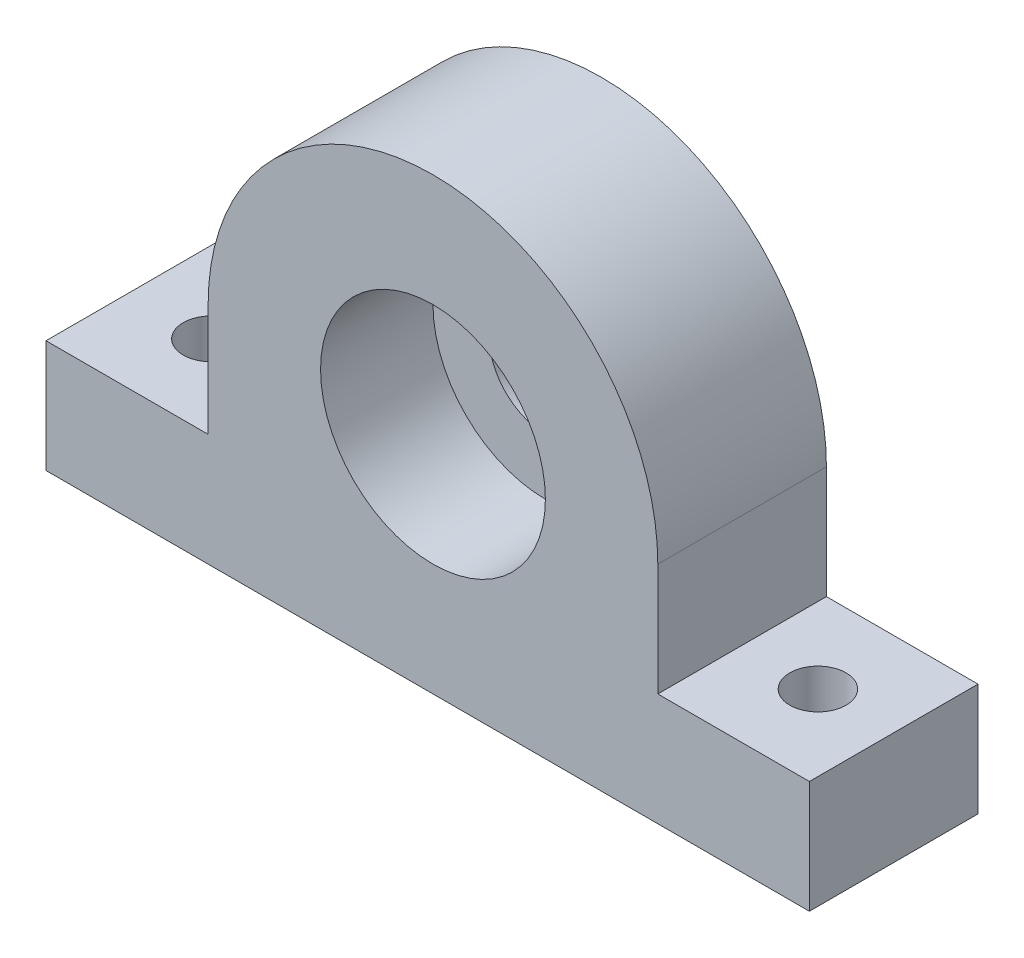
ISO-10303-21;
HEADER;
FILE_DESCRIPTION(('STEP AP214'),'2;1');
FILE_NAME('part.step','',(''),(''),'','','');
FILE_SCHEMA(('AUTOMOTIVE_DESIGN { 1 0 10303 214 1 1 1 1 }'));
ENDSEC;
DATA;
#1=APPLICATION_CONTEXT('core data for automotive mechanical design processes');
#2=APPLICATION_PROTOCOL_DEFINITION('international standard','automotive_design',2000,#1);
#3=PRODUCT_CONTEXT('',#1,'mechanical');
#4=PRODUCT('Part','Part','',(#3));
#5=PRODUCT_RELATED_PRODUCT_CATEGORY('part','',(#4));
#6=PRODUCT_DEFINITION_FORMATION('','',#4);
#7=PRODUCT_DEFINITION_CONTEXT('part definition',#1,'design');
#8=PRODUCT_DEFINITION('design','',#6,#7);
#9=PRODUCT_DEFINITION_SHAPE('','',#8);
#10=(LENGTH_UNIT() NAMED_UNIT(*) SI_UNIT(.MILLI.,.METRE.));
#11=(NAMED_UNIT(*) PLANE_ANGLE_UNIT() SI_UNIT($,.RADIAN.));
#12=(NAMED_UNIT(*) SI_UNIT($,.STERADIAN.) SOLID_ANGLE_UNIT());
#13=UNCERTAINTY_MEASURE_WITH_UNIT(LENGTH_MEASURE(1.E-05),#10,'distance_accuracy_value','');
#14=(GEOMETRIC_REPRESENTATION_CONTEXT(3) GLOBAL_UNCERTAINTY_ASSIGNED_CONTEXT((#13)) GLOBAL_UNIT_ASSIGNED_CONTEXT((#10,
#11,#12)) REPRESENTATION_CONTEXT('',''));
#15=CARTESIAN_POINT('',(0.,0.,0.));
#16=DIRECTION('',(0.,0.,1.));
#17=DIRECTION('',(1.,0.,0.));
#18=AXIS2_PLACEMENT_3D('',#15,#16,#17);
#19=CARTESIAN_POINT('',(0.,25.4,19.05));
#20=DIRECTION('',(0.,0.,-1.));
#21=DIRECTION('',(-1.,0.,0.));
#22=AXIS2_PLACEMENT_3D('',#19,#20,#21);
#23=CYLINDRICAL_SURFACE('',#22,6.35);
#24=CARTESIAN_POINT('',(0.,25.4,0.));
#25=DIRECTION('',(0.,0.,1.));
#26=DIRECTION('',(1.,0.,0.));
#27=AXIS2_PLACEMENT_3D('',#24,#25,#26);
#28=CIRCLE('',#27,6.35);
#29=CARTESIAN_POINT('',(-6.35,25.4,0.));
#30=VERTEX_POINT('',#29);
#31=EDGE_CURVE('E138',#30,#30,#28,.T.);
#32=CARTESIAN_POINT('',(0.,25.4,6.35));
#33=DIRECTION('',(0.,0.,1.));
#34=DIRECTION('',(1.,0.,0.));
#35=AXIS2_PLACEMENT_3D('',#32,#33,#34);
#36=CIRCLE('',#35,6.35);
#37=CARTESIAN_POINT('',(-6.35,25.4,6.35));
#38=VERTEX_POINT('',#37);
#39=EDGE_CURVE('E42',#38,#38,#36,.T.);
#40=CARTESIAN_POINT('',(-6.35,25.4,0.));
#41=CARTESIAN_POINT('',(-6.35,25.4,0.0661458333333329));
#42=CARTESIAN_POINT('',(-6.35,25.4,0.132291666666666));
#43=CARTESIAN_POINT('',(-6.35,25.4,0.264583333333333));
#44=CARTESIAN_POINT('',(-6.35,25.4,0.330729166666667));
#45=CARTESIAN_POINT('',(-6.35,25.4,0.463020833333334));
#46=CARTESIAN_POINT('',(-6.35,25.4,0.529166666666667));
#47=CARTESIAN_POINT('',(-6.35,25.4,0.661458333333333));
#48=CARTESIAN_POINT('',(-6.35,25.4,0.727604166666666));
#49=CARTESIAN_POINT('',(-6.35,25.4,0.859895833333334));
#50=CARTESIAN_POINT('',(-6.35,25.4,0.926041666666668));
#51=CARTESIAN_POINT('',(-6.35,25.4,1.05833333333333));
#52=CARTESIAN_POINT('',(-6.35,25.4,1.12447916666667));
#53=CARTESIAN_POINT('',(-6.35,25.4,1.25677083333333));
#54=CARTESIAN_POINT('',(-6.35,25.4,1.32291666666667));
#55=CARTESIAN_POINT('',(-6.35,25.4,1.45520833333333));
#56=CARTESIAN_POINT('',(-6.35,25.4,1.52135416666667));
#57=CARTESIAN_POINT('',(-6.35,25.4,1.65364583333333));
#58=CARTESIAN_POINT('',(-6.35,25.4,1.71979166666667));
#59=CARTESIAN_POINT('',(-6.35,25.4,1.85208333333333));
#60=CARTESIAN_POINT('',(-6.35,25.4,1.91822916666667));
#61=CARTESIAN_POINT('',(-6.35,25.4,2.05052083333333));
#62=CARTESIAN_POINT('',(-6.35,25.4,2.11666666666667));
#63=CARTESIAN_POINT('',(-6.35,25.4,2.24895833333333));
#64=CARTESIAN_POINT('',(-6.35,25.4,2.31510416666667));
#65=CARTESIAN_POINT('',(-6.35,25.4,2.44739583333333));
#66=CARTESIAN_POINT('',(-6.35,25.4,2.51354166666667));
#67=CARTESIAN_POINT('',(-6.35,25.4,2.64583333333333));
#68=CARTESIAN_POINT('',(-6.35,25.4,2.71197916666667));
#69=CARTESIAN_POINT('',(-6.35,25.4,2.84427083333333));
#70=CARTESIAN_POINT('',(-6.35,25.4,2.91041666666667));
#71=CARTESIAN_POINT('',(-6.35,25.4,3.04270833333333));
#72=CARTESIAN_POINT('',(-6.35,25.4,3.10885416666667));
#73=CARTESIAN_POINT('',(-6.35,25.4,3.24114583333333));
#74=CARTESIAN_POINT('',(-6.35,25.4,3.30729166666667));
#75=CARTESIAN_POINT('',(-6.35,25.4,3.43958333333333));
#76=CARTESIAN_POINT('',(-6.35,25.4,3.50572916666667));
#77=CARTESIAN_POINT('',(-6.35,25.4,3.63802083333333));
#78=CARTESIAN_POINT('',(-6.35,25.4,3.70416666666667));
#79=CARTESIAN_POINT('',(-6.35,25.4,3.83645833333333));
#80=CARTESIAN_POINT('',(-6.35,25.4,3.90260416666667));
#81=CARTESIAN_POINT('',(-6.35,25.4,4.03489583333333));
#82=CARTESIAN_POINT('',(-6.35,25.4,4.10104166666667));
#83=CARTESIAN_POINT('',(-6.35,25.4,4.23333333333333));
#84=CARTESIAN_POINT('',(-6.35,25.4,4.29947916666667));
#85=CARTESIAN_POINT('',(-6.35,25.4,4.43177083333333));
#86=CARTESIAN_POINT('',(-6.35,25.4,4.49791666666667));
#87=CARTESIAN_POINT('',(-6.35,25.4,4.63020833333333));
#88=CARTESIAN_POINT('',(-6.35,25.4,4.69635416666667));
#89=CARTESIAN_POINT('',(-6.35,25.4,4.82864583333333));
#90=CARTESIAN_POINT('',(-6.35,25.4,4.89479166666667));
#91=CARTESIAN_POINT('',(-6.35,25.4,5.02708333333333));
#92=CARTESIAN_POINT('',(-6.35,25.4,5.09322916666667));
#93=CARTESIAN_POINT('',(-6.35,25.4,5.22552083333333));
#94=CARTESIAN_POINT('',(-6.35,25.4,5.29166666666667));
#95=CARTESIAN_POINT('',(-6.35,25.4,5.42395833333333));
#96=CARTESIAN_POINT('',(-6.35,25.4,5.49010416666667));
#97=CARTESIAN_POINT('',(-6.35,25.4,5.62239583333333));
#98=CARTESIAN_POINT('',(-6.35,25.4,5.68854166666667));
#99=CARTESIAN_POINT('',(-6.35,25.4,5.82083333333333));
#100=CARTESIAN_POINT('',(-6.35,25.4,5.88697916666667));
#101=CARTESIAN_POINT('',(-6.35,25.4,6.01927083333333));
#102=CARTESIAN_POINT('',(-6.35,25.4,6.08541666666667));
#103=CARTESIAN_POINT('',(-6.35,25.4,6.21770833333333));
#104=CARTESIAN_POINT('',(-6.35,25.4,6.28385416666667));
#105=CARTESIAN_POINT('',(-6.35,25.4,6.35));
#106=B_SPLINE_CURVE_WITH_KNOTS('',3,(#40,#41,#42,#43,#44,#45,#46,#47,#48,#49,#50,#51,#52,#53,
#54,#55,#56,#57,#58,#59,#60,#61,#62,#63,#64,#65,#66,#67,#68,#69,#70,#71,#72,#73,#74,#75,#76,#77,
#78,#79,#80,#81,#82,#83,#84,#85,#86,#87,#88,#89,#90,#91,#92,#93,#94,#95,#96,#97,#98,#99,#100,
#101,#102,#103,#104,#105),.UNSPECIFIED.,.F.,.F.,(4,2,2,2,2,2,2,2,2,2,2,2,2,2,2,2,2,2,2,2,2,2,2,
2,2,2,2,2,2,2,2,2,4),(0.,0.198437499999999,0.396875000000001,0.5953125,0.793749999999999,
0.992187500000002,1.190625,1.3890625,1.5875,1.7859375,1.984375,2.1828125,2.38125,2.5796875,
2.778125,2.9765625,3.175,3.3734375,3.571875,3.7703125,3.96875,4.1671875,4.365625,4.5640625,
4.7625,4.9609375,5.159375,5.3578125,5.55625,5.7546875,5.953125,6.1515625,6.35),.UNSPECIFIED.);
#107=EDGE_CURVE('BSEAM39',#30,#38,#106,.T.);
#108=ORIENTED_EDGE('',*,*,#31,.F.);
#109=ORIENTED_EDGE('',*,*,#39,.T.);
#110=ORIENTED_EDGE('',*,*,#107,.T.);
#111=ORIENTED_EDGE('',*,*,#107,.F.);
#112=EDGE_LOOP('',(#108,#110,#109,#111));
#113=FACE_BOUND('',#112,.T.);
#114=ADVANCED_FACE('F39',(#113),#23,.F.);
#115=CARTESIAN_POINT('',(25.4,0.,19.05));
#116=DIRECTION('',(1.,0.,0.));
#117=DIRECTION('',(0.,0.,-1.));
#118=AXIS2_PLACEMENT_3D('',#115,#116,#117);
#119=PLANE('',#118);
#120=DIRECTION('',(0.,-1.,0.));
#121=VECTOR('',#120,1.);
#122=CARTESIAN_POINT('',(25.4,0.,0.));
#123=LINE('',#122,#121);
#124=CARTESIAN_POINT('',(25.4,25.4,0.));
#125=VERTEX_POINT('',#124);
#126=CARTESIAN_POINT('',(25.4,12.7,0.));
#127=VERTEX_POINT('',#126);
#128=EDGE_CURVE('E142',#125,#127,#123,.T.);
#129=ORIENTED_EDGE('',*,*,#128,.F.);
#130=DIRECTION('',(0.,0.,-1.));
#131=VECTOR('',#130,1.);
#132=CARTESIAN_POINT('',(25.4,25.4,19.05));
#133=LINE('',#132,#131);
#134=CARTESIAN_POINT('',(25.4,25.4,19.05));
#135=VERTEX_POINT('',#134);
#136=EDGE_CURVE('E11',#135,#125,#133,.T.);
#137=ORIENTED_EDGE('',*,*,#136,.F.);
#138=DIRECTION('',(0.,-1.,0.));
#139=VECTOR('',#138,1.);
#140=CARTESIAN_POINT('',(25.4,0.,19.05));
#141=LINE('',#140,#139);
#142=CARTESIAN_POINT('',(25.4,12.7,19.05));
#143=VERTEX_POINT('',#142);
#144=EDGE_CURVE('E170',#135,#143,#141,.T.);
#145=ORIENTED_EDGE('',*,*,#144,.T.);
#146=DIRECTION('',(0.,0.,-1.));
#147=VECTOR('',#146,1.);
#148=CARTESIAN_POINT('',(25.4,12.7,19.05));
#149=LINE('',#148,#147);
#150=EDGE_CURVE('E57',#143,#127,#149,.T.);
#151=ORIENTED_EDGE('',*,*,#150,.T.);
#152=EDGE_LOOP('',(#129,#137,#145,#151));
#153=FACE_BOUND('',#152,.T.);
#154=ADVANCED_FACE('F198',(#153),#119,.T.);
#155=CARTESIAN_POINT('',(0.,25.4,19.05));
#156=DIRECTION('',(0.,0.,-1.));
#157=DIRECTION('',(-1.,0.,0.));
#158=AXIS2_PLACEMENT_3D('',#155,#156,#157);
#159=CYLINDRICAL_SURFACE('',#158,25.4);
#160=CARTESIAN_POINT('',(0.,25.4,0.));
#161=DIRECTION('',(0.,0.,1.));
#162=DIRECTION('',(1.,0.,0.));
#163=AXIS2_PLACEMENT_3D('',#160,#161,#162);
#164=CIRCLE('',#163,25.4);
#165=CARTESIAN_POINT('',(-25.4,25.4,0.));
#166=VERTEX_POINT('',#165);
#167=EDGE_CURVE('E145',#125,#166,#164,.T.);
#168=ORIENTED_EDGE('',*,*,#167,.T.);
#169=DIRECTION('',(0.,0.,-1.));
#170=VECTOR('',#169,1.);
#171=CARTESIAN_POINT('',(-25.4,25.4,19.05));
#172=LINE('',#171,#170);
#173=CARTESIAN_POINT('',(-25.4,25.4,19.05));
#174=VERTEX_POINT('',#173);
#175=EDGE_CURVE('E49',#174,#166,#172,.T.);
#176=ORIENTED_EDGE('',*,*,#175,.F.);
#177=CARTESIAN_POINT('',(0.,25.4,19.05));
#178=DIRECTION('',(0.,0.,1.));
#179=DIRECTION('',(1.,0.,0.));
#180=AXIS2_PLACEMENT_3D('',#177,#178,#179);
#181=CIRCLE('',#180,25.4);
#182=EDGE_CURVE('E279',#135,#174,#181,.T.);
#183=ORIENTED_EDGE('',*,*,#182,.F.);
#184=ORIENTED_EDGE('',*,*,#136,.T.);
#185=EDGE_LOOP('',(#168,#176,#183,#184));
#186=FACE_BOUND('',#185,.T.);
#187=ADVANCED_FACE('F195',(#186),#159,.T.);
#188=CARTESIAN_POINT('',(-25.4,0.,19.05));
#189=DIRECTION('',(1.,0.,0.));
#190=DIRECTION('',(0.,0.,-1.));
#191=AXIS2_PLACEMENT_3D('',#188,#189,#190);
#192=PLANE('',#191);
#193=DIRECTION('',(0.,-1.,0.));
#194=VECTOR('',#193,1.);
#195=CARTESIAN_POINT('',(-25.4,0.,0.));
#196=LINE('',#195,#194);
#197=CARTESIAN_POINT('',(-25.4,12.7,0.));
#198=VERTEX_POINT('',#197);
#199=EDGE_CURVE('E149',#166,#198,#196,.T.);
#200=ORIENTED_EDGE('',*,*,#199,.T.);
#201=DIRECTION('',(0.,0.,-1.));
#202=VECTOR('',#201,1.);
#203=CARTESIAN_POINT('',(-25.4,12.7,19.05));
#204=LINE('',#203,#202);
#205=CARTESIAN_POINT('',(-25.4,12.7,19.05));
#206=VERTEX_POINT('',#205);
#207=EDGE_CURVE('E180',#206,#198,#204,.T.);
#208=ORIENTED_EDGE('',*,*,#207,.F.);
#209=DIRECTION('',(0.,-1.,0.));
#210=VECTOR('',#209,1.);
#211=CARTESIAN_POINT('',(-25.4,0.,19.05));
#212=LINE('',#211,#210);
#213=EDGE_CURVE('E191',#174,#206,#212,.T.);
#214=ORIENTED_EDGE('',*,*,#213,.F.);
#215=ORIENTED_EDGE('',*,*,#175,.T.);
#216=EDGE_LOOP('',(#200,#208,#214,#215));
#217=FACE_BOUND('',#216,.T.);
#218=ADVANCED_FACE('F188',(#217),#192,.F.);
#219=CARTESIAN_POINT('',(0.,12.7,19.05));
#220=DIRECTION('',(0.,-1.,0.));
#221=DIRECTION('',(0.,0.,-1.));
#222=AXIS2_PLACEMENT_3D('',#219,#220,#221);
#223=PLANE('',#222);
#224=CARTESIAN_POINT('',(-34.5583596169693,12.7,9.525));
#225=DIRECTION('',(0.,1.,0.));
#226=DIRECTION('',(0.,0.,1.));
#227=AXIS2_PLACEMENT_3D('',#224,#225,#226);
#228=CIRCLE('',#227,3.175);
#229=CARTESIAN_POINT('',(-34.5583596169693,12.7,12.7));
#230=VERTEX_POINT('',#229);
#231=EDGE_CURVE('E255',#230,#230,#228,.T.);
#232=ORIENTED_EDGE('',*,*,#231,.F.);
#233=EDGE_LOOP('',(#232));
#234=FACE_BOUND('',#233,.T.);
#235=DIRECTION('',(-1.,0.,0.));
#236=VECTOR('',#235,1.);
#237=CARTESIAN_POINT('',(0.,12.7,0.));
#238=LINE('',#237,#236);
#239=CARTESIAN_POINT('',(-43.7167192339386,12.7,0.));
#240=VERTEX_POINT('',#239);
#241=EDGE_CURVE('E153',#198,#240,#238,.T.);
#242=ORIENTED_EDGE('',*,*,#241,.T.);
#243=DIRECTION('',(0.,0.,-1.));
#244=VECTOR('',#243,1.);
#245=CARTESIAN_POINT('',(-43.7167192339386,12.7,19.05));
#246=LINE('',#245,#244);
#247=CARTESIAN_POINT('',(-43.7167192339386,12.7,19.05));
#248=VERTEX_POINT('',#247);
#249=EDGE_CURVE('E177',#248,#240,#246,.T.);
#250=ORIENTED_EDGE('',*,*,#249,.F.);
#251=DIRECTION('',(-1.,0.,0.));
#252=VECTOR('',#251,1.);
#253=CARTESIAN_POINT('',(0.,12.7,19.05));
#254=LINE('',#253,#252);
#255=EDGE_CURVE('E284',#206,#248,#254,.T.);
#256=ORIENTED_EDGE('',*,*,#255,.F.);
#257=ORIENTED_EDGE('',*,*,#207,.T.);
#258=EDGE_LOOP('',(#242,#250,#256,#257));
#259=FACE_BOUND('',#258,.T.);
#260=ADVANCED_FACE('F209',(#234,#259),#223,.F.);
#261=CARTESIAN_POINT('',(-43.7167192339386,0.,19.05));
#262=DIRECTION('',(-1.,0.,0.));
#263=DIRECTION('',(0.,0.,1.));
#264=AXIS2_PLACEMENT_3D('',#261,#262,#263);
#265=PLANE('',#264);
#266=DIRECTION('',(0.,1.,0.));
#267=VECTOR('',#266,1.);
#268=CARTESIAN_POINT('',(-43.7167192339386,0.,0.));
#269=LINE('',#268,#267);
#270=CARTESIAN_POINT('',(-43.7167192339386,0.,0.));
#271=VERTEX_POINT('',#270);
#272=EDGE_CURVE('E157',#271,#240,#269,.T.);
#273=ORIENTED_EDGE('',*,*,#272,.F.);
#274=DIRECTION('',(0.,0.,-1.));
#275=VECTOR('',#274,1.);
#276=CARTESIAN_POINT('',(-43.7167192339386,0.,19.05));
#277=LINE('',#276,#275);
#278=CARTESIAN_POINT('',(-43.7167192339386,0.,19.05));
#279=VERTEX_POINT('',#278);
#280=EDGE_CURVE('E128',#279,#271,#277,.T.);
#281=ORIENTED_EDGE('',*,*,#280,.F.);
#282=DIRECTION('',(0.,1.,0.));
#283=VECTOR('',#282,1.);
#284=CARTESIAN_POINT('',(-43.7167192339386,0.,19.05));
#285=LINE('',#284,#283);
#286=EDGE_CURVE('E116',#279,#248,#285,.T.);
#287=ORIENTED_EDGE('',*,*,#286,.T.);
#288=ORIENTED_EDGE('',*,*,#249,.T.);
#289=EDGE_LOOP('',(#273,#281,#287,#288));
#290=FACE_BOUND('',#289,.T.);
#291=ADVANCED_FACE('F212',(#290),#265,.T.);
#292=CARTESIAN_POINT('',(0.,0.,19.05));
#293=DIRECTION('',(0.,1.,0.));
#294=DIRECTION('',(0.,0.,1.));
#295=AXIS2_PLACEMENT_3D('',#292,#293,#294);
#296=PLANE('',#295);
#297=CARTESIAN_POINT('',(-34.5583596169693,0.,9.525));
#298=DIRECTION('',(0.,1.,0.));
#299=DIRECTION('',(0.,0.,1.));
#300=AXIS2_PLACEMENT_3D('',#297,#298,#299);
#301=CIRCLE('',#300,3.175);
#302=CARTESIAN_POINT('',(-34.5583596169693,0.,12.7));
#303=VERTEX_POINT('',#302);
#304=EDGE_CURVE('E252',#303,#303,#301,.F.);
#305=ORIENTED_EDGE('',*,*,#304,.F.);
#306=EDGE_LOOP('',(#305));
#307=FACE_BOUND('',#306,.T.);
#308=CARTESIAN_POINT('',(33.9615256184222,0.,9.525));
#309=DIRECTION('',(0.,1.,0.));
#310=DIRECTION('',(0.,0.,1.));
#311=AXIS2_PLACEMENT_3D('',#308,#309,#310);
#312=CIRCLE('',#311,3.175);
#313=CARTESIAN_POINT('',(33.9615256184222,0.,12.7));
#314=VERTEX_POINT('',#313);
#315=EDGE_CURVE('E257',#314,#314,#312,.F.);
#316=ORIENTED_EDGE('',*,*,#315,.F.);
#317=EDGE_LOOP('',(#316));
#318=FACE_BOUND('',#317,.T.);
#319=DIRECTION('',(1.,0.,0.));
#320=VECTOR('',#319,1.);
#321=CARTESIAN_POINT('',(0.,0.,0.));
#322=LINE('',#321,#320);
#323=CARTESIAN_POINT('',(42.5230512368443,0.,0.));
#324=VERTEX_POINT('',#323);
#325=EDGE_CURVE('E124',#271,#324,#322,.T.);
#326=ORIENTED_EDGE('',*,*,#325,.T.);
#327=DIRECTION('',(0.,0.,-1.));
#328=VECTOR('',#327,1.);
#329=CARTESIAN_POINT('',(42.5230512368443,0.,19.05));
#330=LINE('',#329,#328);
#331=CARTESIAN_POINT('',(42.5230512368443,0.,19.05));
#332=VERTEX_POINT('',#331);
#333=EDGE_CURVE('E121',#332,#324,#330,.T.);
#334=ORIENTED_EDGE('',*,*,#333,.F.);
#335=DIRECTION('',(1.,0.,0.));
#336=VECTOR('',#335,1.);
#337=CARTESIAN_POINT('',(0.,0.,19.05));
#338=LINE('',#337,#336);
#339=EDGE_CURVE('E108',#279,#332,#338,.T.);
#340=ORIENTED_EDGE('',*,*,#339,.F.);
#341=ORIENTED_EDGE('',*,*,#280,.T.);
#342=EDGE_LOOP('',(#326,#334,#340,#341));
#343=FACE_BOUND('',#342,.T.);
#344=ADVANCED_FACE('F122',(#307,#318,#343),#296,.F.);
#345=CARTESIAN_POINT('',(42.5230512368443,0.,19.05));
#346=DIRECTION('',(1.,0.,0.));
#347=DIRECTION('',(0.,0.,-1.));
#348=AXIS2_PLACEMENT_3D('',#345,#346,#347);
#349=PLANE('',#348);
#350=DIRECTION('',(0.,-1.,0.));
#351=VECTOR('',#350,1.);
#352=CARTESIAN_POINT('',(42.5230512368443,0.,0.));
#353=LINE('',#352,#351);
#354=CARTESIAN_POINT('',(42.5230512368443,12.7,0.));
#355=VERTEX_POINT('',#354);
#356=EDGE_CURVE('E163',#355,#324,#353,.T.);
#357=ORIENTED_EDGE('',*,*,#356,.F.);
#358=DIRECTION('',(0.,0.,-1.));
#359=VECTOR('',#358,1.);
#360=CARTESIAN_POINT('',(42.5230512368443,12.7,19.05));
#361=LINE('',#360,#359);
#362=CARTESIAN_POINT('',(42.5230512368443,12.7,19.05));
#363=VERTEX_POINT('',#362);
#364=EDGE_CURVE('E82',#363,#355,#361,.T.);
#365=ORIENTED_EDGE('',*,*,#364,.F.);
#366=DIRECTION('',(0.,-1.,0.));
#367=VECTOR('',#366,1.);
#368=CARTESIAN_POINT('',(42.5230512368443,0.,19.05));
#369=LINE('',#368,#367);
#370=EDGE_CURVE('E114',#363,#332,#369,.T.);
#371=ORIENTED_EDGE('',*,*,#370,.T.);
#372=ORIENTED_EDGE('',*,*,#333,.T.);
#373=EDGE_LOOP('',(#357,#365,#371,#372));
#374=FACE_BOUND('',#373,.T.);
#375=ADVANCED_FACE('F130',(#374),#349,.T.);
#376=CARTESIAN_POINT('',(0.,12.7,19.05));
#377=DIRECTION('',(0.,1.,0.));
#378=DIRECTION('',(0.,0.,1.));
#379=AXIS2_PLACEMENT_3D('',#376,#377,#378);
#380=PLANE('',#379);
#381=CARTESIAN_POINT('',(33.9615256184222,12.7,9.525));
#382=DIRECTION('',(0.,1.,0.));
#383=DIRECTION('',(0.,0.,1.));
#384=AXIS2_PLACEMENT_3D('',#381,#382,#383);
#385=CIRCLE('',#384,3.175);
#386=CARTESIAN_POINT('',(33.9615256184222,12.7,12.7));
#387=VERTEX_POINT('',#386);
#388=EDGE_CURVE('E264',#387,#387,#385,.T.);
#389=ORIENTED_EDGE('',*,*,#388,.F.);
#390=EDGE_LOOP('',(#389));
#391=FACE_BOUND('',#390,.T.);
#392=DIRECTION('',(1.,0.,0.));
#393=VECTOR('',#392,1.);
#394=CARTESIAN_POINT('',(0.,12.7,0.));
#395=LINE('',#394,#393);
#396=EDGE_CURVE('E166',#127,#355,#395,.T.);
#397=ORIENTED_EDGE('',*,*,#396,.F.);
#398=ORIENTED_EDGE('',*,*,#150,.F.);
#399=DIRECTION('',(1.,0.,0.));
#400=VECTOR('',#399,1.);
#401=CARTESIAN_POINT('',(0.,12.7,19.05));
#402=LINE('',#401,#400);
#403=EDGE_CURVE('E132',#143,#363,#402,.T.);
#404=ORIENTED_EDGE('',*,*,#403,.T.);
#405=ORIENTED_EDGE('',*,*,#364,.T.);
#406=EDGE_LOOP('',(#397,#398,#404,#405));
#407=FACE_BOUND('',#406,.T.);
#408=ADVANCED_FACE('F222',(#391,#407),#380,.T.);
#409=CARTESIAN_POINT('',(0.,0.,19.05));
#410=DIRECTION('',(0.,0.,1.));
#411=DIRECTION('',(1.,0.,0.));
#412=AXIS2_PLACEMENT_3D('',#409,#410,#411);
#413=PLANE('',#412);
#414=CARTESIAN_POINT('',(0.,25.4,19.05));
#415=DIRECTION('',(0.,0.,1.));
#416=DIRECTION('',(1.,0.,0.));
#417=AXIS2_PLACEMENT_3D('',#414,#415,#416);
#418=CIRCLE('',#417,12.7);
#419=CARTESIAN_POINT('',(12.7,25.4,19.05));
#420=VERTEX_POINT('',#419);
#421=EDGE_CURVE('E261',#420,#420,#418,.T.);
#422=ORIENTED_EDGE('',*,*,#421,.F.);
#423=EDGE_LOOP('',(#422));
#424=FACE_BOUND('',#423,.T.);
#425=ORIENTED_EDGE('',*,*,#144,.F.);
#426=ORIENTED_EDGE('',*,*,#182,.T.);
#427=ORIENTED_EDGE('',*,*,#213,.T.);
#428=ORIENTED_EDGE('',*,*,#255,.T.);
#429=ORIENTED_EDGE('',*,*,#286,.F.);
#430=ORIENTED_EDGE('',*,*,#339,.T.);
#431=ORIENTED_EDGE('',*,*,#370,.F.);
#432=ORIENTED_EDGE('',*,*,#403,.F.);
#433=EDGE_LOOP('',(#425,#426,#427,#428,#429,#430,#431,#432));
#434=FACE_BOUND('',#433,.T.);
#435=ADVANCED_FACE('F111',(#424,#434),#413,.T.);
#436=CARTESIAN_POINT('',(0.,0.,0.));
#437=DIRECTION('',(0.,0.,1.));
#438=DIRECTION('',(1.,0.,0.));
#439=AXIS2_PLACEMENT_3D('',#436,#437,#438);
#440=PLANE('',#439);
#441=ORIENTED_EDGE('',*,*,#31,.T.);
#442=EDGE_LOOP('',(#441));
#443=FACE_BOUND('',#442,.T.);
#444=ORIENTED_EDGE('',*,*,#128,.T.);
#445=ORIENTED_EDGE('',*,*,#396,.T.);
#446=ORIENTED_EDGE('',*,*,#356,.T.);
#447=ORIENTED_EDGE('',*,*,#325,.F.);
#448=ORIENTED_EDGE('',*,*,#272,.T.);
#449=ORIENTED_EDGE('',*,*,#241,.F.);
#450=ORIENTED_EDGE('',*,*,#199,.F.);
#451=ORIENTED_EDGE('',*,*,#167,.F.);
#452=EDGE_LOOP('',(#444,#445,#446,#447,#448,#449,#450,#451));
#453=FACE_BOUND('',#452,.T.);
#454=ADVANCED_FACE('F197',(#443,#453),#440,.F.);
#455=CARTESIAN_POINT('',(0.,25.4,6.35));
#456=DIRECTION('',(0.,0.,1.));
#457=DIRECTION('',(1.,0.,0.));
#458=AXIS2_PLACEMENT_3D('',#455,#456,#457);
#459=CYLINDRICAL_SURFACE('',#458,12.7);
#460=CARTESIAN_POINT('',(0.,25.4,6.35));
#461=DIRECTION('',(0.,0.,1.));
#462=DIRECTION('',(1.,0.,0.));
#463=AXIS2_PLACEMENT_3D('',#460,#461,#462);
#464=CIRCLE('',#463,12.7);
#465=CARTESIAN_POINT('',(12.7,25.4,6.35));
#466=VERTEX_POINT('',#465);
#467=EDGE_CURVE('E270',#466,#466,#464,.T.);
#468=ORIENTED_EDGE('',*,*,#467,.F.);
#469=EDGE_LOOP('',(#468));
#470=FACE_BOUND('',#469,.T.);
#471=ORIENTED_EDGE('',*,*,#421,.T.);
#472=EDGE_LOOP('',(#471));
#473=FACE_BOUND('',#472,.T.);
#474=ADVANCED_FACE('F228',(#470,#473),#459,.F.);
#475=CARTESIAN_POINT('',(0.,25.4,6.35));
#476=DIRECTION('',(0.,0.,1.));
#477=DIRECTION('',(1.,0.,0.));
#478=AXIS2_PLACEMENT_3D('',#475,#476,#477);
#479=PLANE('',#478);
#480=ORIENTED_EDGE('',*,*,#39,.F.);
#481=EDGE_LOOP('',(#480));
#482=FACE_BOUND('',#481,.T.);
#483=ORIENTED_EDGE('',*,*,#467,.T.);
#484=EDGE_LOOP('',(#483));
#485=FACE_BOUND('',#484,.T.);
#486=ADVANCED_FACE('F235',(#482,#485),#479,.T.);
#487=CARTESIAN_POINT('',(33.9615256184222,-8.98025612106914,9.525));
#488=DIRECTION('',(0.,1.,0.));
#489=DIRECTION('',(0.,0.,1.));
#490=AXIS2_PLACEMENT_3D('',#487,#488,#489);
#491=CYLINDRICAL_SURFACE('',#490,3.175);
#492=ORIENTED_EDGE('',*,*,#315,.T.);
#493=EDGE_LOOP('',(#492));
#494=FACE_BOUND('',#493,.T.);
#495=ORIENTED_EDGE('',*,*,#388,.T.);
#496=EDGE_LOOP('',(#495));
#497=FACE_BOUND('',#496,.T.);
#498=ADVANCED_FACE('F239',(#494,#497),#491,.F.);
#499=CARTESIAN_POINT('',(-34.5583596169693,-8.98025612106914,9.525));
#500=DIRECTION('',(0.,1.,0.));
#501=DIRECTION('',(0.,0.,1.));
#502=AXIS2_PLACEMENT_3D('',#499,#500,#501);
#503=CYLINDRICAL_SURFACE('',#502,3.175);
#504=ORIENTED_EDGE('',*,*,#304,.T.);
#505=EDGE_LOOP('',(#504));
#506=FACE_BOUND('',#505,.T.);
#507=ORIENTED_EDGE('',*,*,#231,.T.);
#508=EDGE_LOOP('',(#507));
#509=FACE_BOUND('',#508,.T.);
#510=ADVANCED_FACE('F243',(#506,#509),#503,.F.);
#511=CLOSED_SHELL('',(#114,#154,#187,#218,#260,#291,#344,#375,#408,#435,#454,#474,#486,#498,#510));
#512=MANIFOLD_SOLID_BREP('B2',#511);
#513=ADVANCED_BREP_SHAPE_REPRESENTATION('',(#18,#512),#14);
#514=SHAPE_DEFINITION_REPRESENTATION(#9,#513);
ENDSEC;
END-ISO-10303-21;
